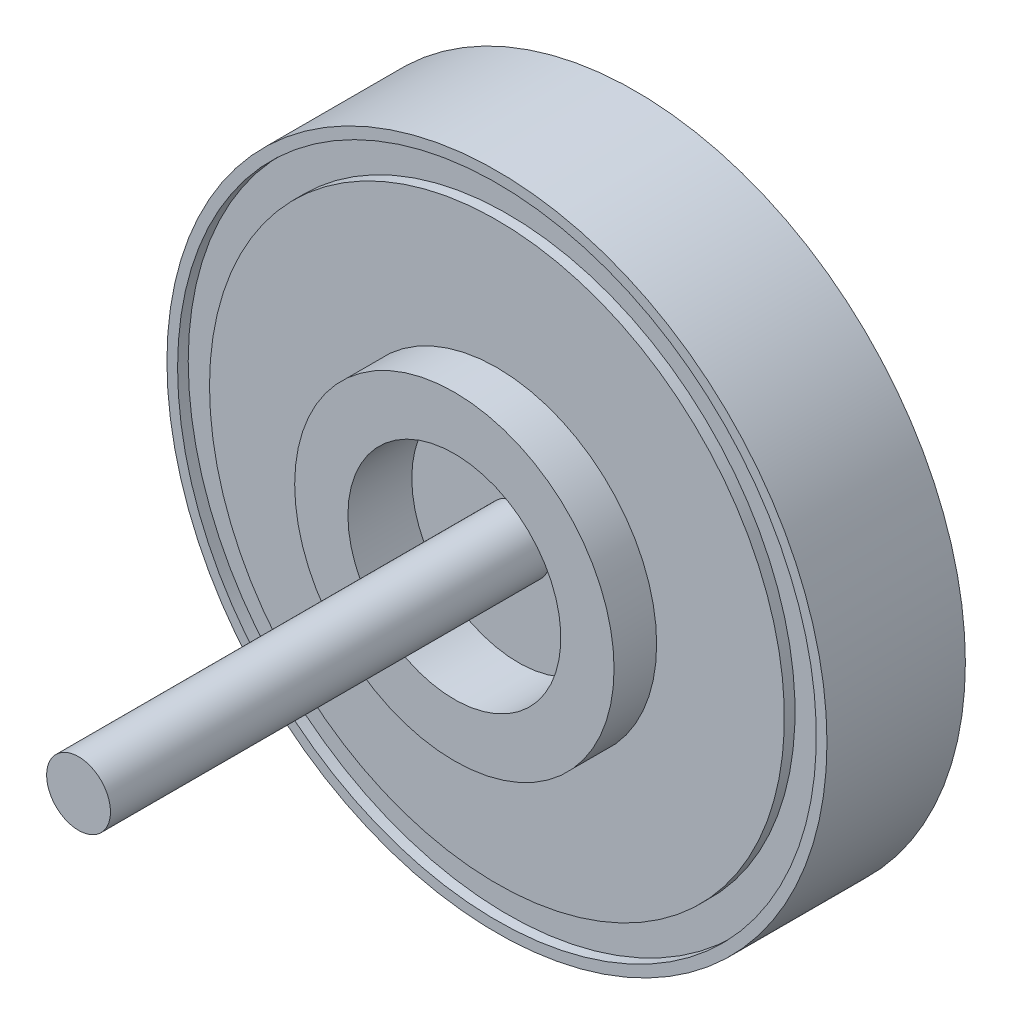
ISO-10303-21;
HEADER;
FILE_DESCRIPTION(('STEP AP214'),'2;1');
FILE_NAME('part.step','',(''),(''),'','','');
FILE_SCHEMA(('AUTOMOTIVE_DESIGN { 1 0 10303 214 1 1 1 1 }'));
ENDSEC;
DATA;
#1=APPLICATION_CONTEXT('core data for automotive mechanical design processes');
#2=APPLICATION_PROTOCOL_DEFINITION('international standard','automotive_design',2000,#1);
#3=PRODUCT_CONTEXT('',#1,'mechanical');
#4=PRODUCT('Part','Part','',(#3));
#5=PRODUCT_RELATED_PRODUCT_CATEGORY('part','',(#4));
#6=PRODUCT_DEFINITION_FORMATION('','',#4);
#7=PRODUCT_DEFINITION_CONTEXT('part definition',#1,'design');
#8=PRODUCT_DEFINITION('design','',#6,#7);
#9=PRODUCT_DEFINITION_SHAPE('','',#8);
#10=(LENGTH_UNIT() NAMED_UNIT(*) SI_UNIT(.MILLI.,.METRE.));
#11=(NAMED_UNIT(*) PLANE_ANGLE_UNIT() SI_UNIT($,.RADIAN.));
#12=(NAMED_UNIT(*) SI_UNIT($,.STERADIAN.) SOLID_ANGLE_UNIT());
#13=UNCERTAINTY_MEASURE_WITH_UNIT(LENGTH_MEASURE(1.E-05),#10,'distance_accuracy_value','');
#14=(GEOMETRIC_REPRESENTATION_CONTEXT(3) GLOBAL_UNCERTAINTY_ASSIGNED_CONTEXT((#13)) GLOBAL_UNIT_ASSIGNED_CONTEXT((#10,
#11,#12)) REPRESENTATION_CONTEXT('',''));
#15=CARTESIAN_POINT('',(0.,0.,0.));
#16=DIRECTION('',(0.,0.,1.));
#17=DIRECTION('',(1.,0.,0.));
#18=AXIS2_PLACEMENT_3D('',#15,#16,#17);
#19=CARTESIAN_POINT('',(0.,0.,41.3));
#20=DIRECTION('',(0.,0.,1.));
#21=DIRECTION('',(1.,0.,0.));
#22=AXIS2_PLACEMENT_3D('',#19,#20,#21);
#23=PLANE('',#22);
#24=CARTESIAN_POINT('',(0.,0.,41.3));
#25=DIRECTION('',(0.,0.,-1.));
#26=DIRECTION('',(-1.,0.,0.));
#27=AXIS2_PLACEMENT_3D('',#24,#25,#26);
#28=CIRCLE('',#27,3.);
#29=CARTESIAN_POINT('',(-3.,0.,41.3));
#30=VERTEX_POINT('',#29);
#31=EDGE_CURVE('E10',#30,#30,#28,.T.);
#32=ORIENTED_EDGE('',*,*,#31,.F.);
#33=EDGE_LOOP('',(#32));
#34=FACE_BOUND('',#33,.T.);
#35=ADVANCED_FACE('F30',(#34),#23,.T.);
#36=CARTESIAN_POINT('',(0.,0.,-13.7));
#37=DIRECTION('',(0.,0.,-1.));
#38=DIRECTION('',(-1.,0.,0.));
#39=AXIS2_PLACEMENT_3D('',#36,#37,#38);
#40=CYLINDRICAL_SURFACE('',#39,3.);
#41=ORIENTED_EDGE('',*,*,#31,.T.);
#42=EDGE_LOOP('',(#41));
#43=FACE_BOUND('',#42,.T.);
#44=CARTESIAN_POINT('',(0.,0.,0.));
#45=DIRECTION('',(0.,0.,-1.));
#46=DIRECTION('',(-1.,0.,0.));
#47=AXIS2_PLACEMENT_3D('',#44,#45,#46);
#48=CIRCLE('',#47,3.);
#49=CARTESIAN_POINT('',(-3.,0.,0.));
#50=VERTEX_POINT('',#49);
#51=EDGE_CURVE('E36',#50,#50,#48,.T.);
#52=ORIENTED_EDGE('',*,*,#51,.F.);
#53=EDGE_LOOP('',(#52));
#54=FACE_BOUND('',#53,.T.);
#55=ADVANCED_FACE('F120',(#43,#54),#40,.T.);
#56=CARTESIAN_POINT('',(0.,3.,0.));
#57=DIRECTION('',(0.,0.,1.));
#58=DIRECTION('',(1.,0.,0.));
#59=AXIS2_PLACEMENT_3D('',#56,#57,#58);
#60=PLANE('',#59);
#61=ORIENTED_EDGE('',*,*,#51,.T.);
#62=EDGE_LOOP('',(#61));
#63=FACE_BOUND('',#62,.T.);
#64=CARTESIAN_POINT('',(0.,0.,0.));
#65=DIRECTION('',(0.,0.,-1.));
#66=DIRECTION('',(-1.,0.,0.));
#67=AXIS2_PLACEMENT_3D('',#64,#65,#66);
#68=CIRCLE('',#67,10.);
#69=CARTESIAN_POINT('',(-10.,0.,0.));
#70=VERTEX_POINT('',#69);
#71=EDGE_CURVE('E40',#70,#70,#68,.T.);
#72=ORIENTED_EDGE('',*,*,#71,.F.);
#73=EDGE_LOOP('',(#72));
#74=FACE_BOUND('',#73,.T.);
#75=ADVANCED_FACE('F125',(#63,#74),#60,.T.);
#76=CARTESIAN_POINT('',(0.,0.,-13.7));
#77=DIRECTION('',(0.,0.,-1.));
#78=DIRECTION('',(-1.,0.,0.));
#79=AXIS2_PLACEMENT_3D('',#76,#77,#78);
#80=CYLINDRICAL_SURFACE('',#79,10.);
#81=ORIENTED_EDGE('',*,*,#71,.T.);
#82=EDGE_LOOP('',(#81));
#83=FACE_BOUND('',#82,.T.);
#84=CARTESIAN_POINT('',(0.,0.,6.));
#85=DIRECTION('',(0.,0.,-1.));
#86=DIRECTION('',(-1.,0.,0.));
#87=AXIS2_PLACEMENT_3D('',#84,#85,#86);
#88=CIRCLE('',#87,10.);
#89=CARTESIAN_POINT('',(-10.,0.,6.));
#90=VERTEX_POINT('',#89);
#91=EDGE_CURVE('E44',#90,#90,#88,.T.);
#92=ORIENTED_EDGE('',*,*,#91,.F.);
#93=EDGE_LOOP('',(#92));
#94=FACE_BOUND('',#93,.T.);
#95=ADVANCED_FACE('F129',(#83,#94),#80,.F.);
#96=CARTESIAN_POINT('',(0.,10.,6.));
#97=DIRECTION('',(0.,0.,1.));
#98=DIRECTION('',(1.,0.,0.));
#99=AXIS2_PLACEMENT_3D('',#96,#97,#98);
#100=PLANE('',#99);
#101=ORIENTED_EDGE('',*,*,#91,.T.);
#102=EDGE_LOOP('',(#101));
#103=FACE_BOUND('',#102,.T.);
#104=CARTESIAN_POINT('',(0.,0.,6.));
#105=DIRECTION('',(0.,0.,-1.));
#106=DIRECTION('',(-1.,0.,0.));
#107=AXIS2_PLACEMENT_3D('',#104,#105,#106);
#108=CIRCLE('',#107,15.);
#109=CARTESIAN_POINT('',(-15.,0.,6.));
#110=VERTEX_POINT('',#109);
#111=EDGE_CURVE('E49',#110,#110,#108,.T.);
#112=ORIENTED_EDGE('',*,*,#111,.F.);
#113=EDGE_LOOP('',(#112));
#114=FACE_BOUND('',#113,.T.);
#115=ADVANCED_FACE('F135',(#103,#114),#100,.T.);
#116=CARTESIAN_POINT('',(0.,0.,-13.7));
#117=DIRECTION('',(0.,0.,-1.));
#118=DIRECTION('',(-1.,0.,0.));
#119=AXIS2_PLACEMENT_3D('',#116,#117,#118);
#120=CYLINDRICAL_SURFACE('',#119,15.);
#121=ORIENTED_EDGE('',*,*,#111,.T.);
#122=EDGE_LOOP('',(#121));
#123=FACE_BOUND('',#122,.T.);
#124=CARTESIAN_POINT('',(0.,0.,2.));
#125=DIRECTION('',(0.,0.,-1.));
#126=DIRECTION('',(-1.,0.,0.));
#127=AXIS2_PLACEMENT_3D('',#124,#125,#126);
#128=CIRCLE('',#127,15.);
#129=CARTESIAN_POINT('',(-15.,0.,2.));
#130=VERTEX_POINT('',#129);
#131=EDGE_CURVE('E52',#130,#130,#128,.T.);
#132=ORIENTED_EDGE('',*,*,#131,.F.);
#133=EDGE_LOOP('',(#132));
#134=FACE_BOUND('',#133,.T.);
#135=ADVANCED_FACE('F139',(#123,#134),#120,.T.);
#136=CARTESIAN_POINT('',(0.,15.,2.));
#137=DIRECTION('',(0.,0.,1.));
#138=DIRECTION('',(1.,0.,0.));
#139=AXIS2_PLACEMENT_3D('',#136,#137,#138);
#140=PLANE('',#139);
#141=ORIENTED_EDGE('',*,*,#131,.T.);
#142=EDGE_LOOP('',(#141));
#143=FACE_BOUND('',#142,.T.);
#144=CARTESIAN_POINT('',(0.,0.,2.));
#145=DIRECTION('',(0.,0.,-1.));
#146=DIRECTION('',(-1.,0.,0.));
#147=AXIS2_PLACEMENT_3D('',#144,#145,#146);
#148=CIRCLE('',#147,27.);
#149=CARTESIAN_POINT('',(-27.,0.,2.));
#150=VERTEX_POINT('',#149);
#151=EDGE_CURVE('E55',#150,#150,#148,.T.);
#152=ORIENTED_EDGE('',*,*,#151,.F.);
#153=EDGE_LOOP('',(#152));
#154=FACE_BOUND('',#153,.T.);
#155=ADVANCED_FACE('F143',(#143,#154),#140,.T.);
#156=CARTESIAN_POINT('',(0.,0.,-13.7));
#157=DIRECTION('',(0.,0.,-1.));
#158=DIRECTION('',(-1.,0.,0.));
#159=AXIS2_PLACEMENT_3D('',#156,#157,#158);
#160=CYLINDRICAL_SURFACE('',#159,27.);
#161=ORIENTED_EDGE('',*,*,#151,.T.);
#162=EDGE_LOOP('',(#161));
#163=FACE_BOUND('',#162,.T.);
#164=CARTESIAN_POINT('',(0.,0.,1.));
#165=DIRECTION('',(0.,0.,-1.));
#166=DIRECTION('',(-1.,0.,0.));
#167=AXIS2_PLACEMENT_3D('',#164,#165,#166);
#168=CIRCLE('',#167,27.);
#169=CARTESIAN_POINT('',(-27.,0.,1.));
#170=VERTEX_POINT('',#169);
#171=EDGE_CURVE('E58',#170,#170,#168,.T.);
#172=ORIENTED_EDGE('',*,*,#171,.F.);
#173=EDGE_LOOP('',(#172));
#174=FACE_BOUND('',#173,.T.);
#175=ADVANCED_FACE('F147',(#163,#174),#160,.T.);
#176=CARTESIAN_POINT('',(0.,27.,1.));
#177=DIRECTION('',(0.,0.,1.));
#178=DIRECTION('',(1.,0.,0.));
#179=AXIS2_PLACEMENT_3D('',#176,#177,#178);
#180=PLANE('',#179);
#181=ORIENTED_EDGE('',*,*,#171,.T.);
#182=EDGE_LOOP('',(#181));
#183=FACE_BOUND('',#182,.T.);
#184=CARTESIAN_POINT('',(0.,0.,1.));
#185=DIRECTION('',(0.,0.,-1.));
#186=DIRECTION('',(-1.,0.,0.));
#187=AXIS2_PLACEMENT_3D('',#184,#185,#186);
#188=CIRCLE('',#187,30.);
#189=CARTESIAN_POINT('',(-30.,0.,1.));
#190=VERTEX_POINT('',#189);
#191=EDGE_CURVE('E61',#190,#190,#188,.T.);
#192=ORIENTED_EDGE('',*,*,#191,.F.);
#193=EDGE_LOOP('',(#192));
#194=FACE_BOUND('',#193,.T.);
#195=ADVANCED_FACE('F151',(#183,#194),#180,.T.);
#196=CARTESIAN_POINT('',(0.,0.,-13.7));
#197=DIRECTION('',(0.,0.,-1.));
#198=DIRECTION('',(-1.,0.,0.));
#199=AXIS2_PLACEMENT_3D('',#196,#197,#198);
#200=CYLINDRICAL_SURFACE('',#199,30.);
#201=ORIENTED_EDGE('',*,*,#191,.T.);
#202=EDGE_LOOP('',(#201));
#203=FACE_BOUND('',#202,.T.);
#204=CARTESIAN_POINT('',(0.,0.,1.99999999999999));
#205=DIRECTION('',(0.,0.,-1.));
#206=DIRECTION('',(-1.,0.,0.));
#207=AXIS2_PLACEMENT_3D('',#204,#205,#206);
#208=CIRCLE('',#207,30.);
#209=CARTESIAN_POINT('',(-30.,0.,1.99999999999999));
#210=VERTEX_POINT('',#209);
#211=EDGE_CURVE('E64',#210,#210,#208,.T.);
#212=ORIENTED_EDGE('',*,*,#211,.F.);
#213=EDGE_LOOP('',(#212));
#214=FACE_BOUND('',#213,.T.);
#215=ADVANCED_FACE('F155',(#203,#214),#200,.F.);
#216=CARTESIAN_POINT('',(0.,30.,1.99999999999999));
#217=DIRECTION('',(0.,0.,1.));
#218=DIRECTION('',(1.,0.,0.));
#219=AXIS2_PLACEMENT_3D('',#216,#217,#218);
#220=PLANE('',#219);
#221=ORIENTED_EDGE('',*,*,#211,.T.);
#222=EDGE_LOOP('',(#221));
#223=FACE_BOUND('',#222,.T.);
#224=CARTESIAN_POINT('',(0.,0.,1.99999999999999));
#225=DIRECTION('',(0.,0.,-1.));
#226=DIRECTION('',(-1.,0.,0.));
#227=AXIS2_PLACEMENT_3D('',#224,#225,#226);
#228=CIRCLE('',#227,31.);
#229=CARTESIAN_POINT('',(-31.,0.,1.99999999999999));
#230=VERTEX_POINT('',#229);
#231=EDGE_CURVE('E67',#230,#230,#228,.T.);
#232=ORIENTED_EDGE('',*,*,#231,.F.);
#233=EDGE_LOOP('',(#232));
#234=FACE_BOUND('',#233,.T.);
#235=ADVANCED_FACE('F159',(#223,#234),#220,.T.);
#236=CARTESIAN_POINT('',(0.,0.,-13.7));
#237=DIRECTION('',(0.,0.,-1.));
#238=DIRECTION('',(-1.,0.,0.));
#239=AXIS2_PLACEMENT_3D('',#236,#237,#238);
#240=CYLINDRICAL_SURFACE('',#239,31.);
#241=ORIENTED_EDGE('',*,*,#231,.T.);
#242=EDGE_LOOP('',(#241));
#243=FACE_BOUND('',#242,.T.);
#244=CARTESIAN_POINT('',(0.,0.,-11.));
#245=DIRECTION('',(0.,0.,-1.));
#246=DIRECTION('',(-1.,0.,0.));
#247=AXIS2_PLACEMENT_3D('',#244,#245,#246);
#248=CIRCLE('',#247,31.);
#249=CARTESIAN_POINT('',(-31.,0.,-11.));
#250=VERTEX_POINT('',#249);
#251=EDGE_CURVE('E70',#250,#250,#248,.T.);
#252=ORIENTED_EDGE('',*,*,#251,.F.);
#253=EDGE_LOOP('',(#252));
#254=FACE_BOUND('',#253,.T.);
#255=ADVANCED_FACE('F163',(#243,#254),#240,.T.);
#256=CARTESIAN_POINT('',(0.,31.,-11.));
#257=DIRECTION('',(0.,0.,-1.));
#258=DIRECTION('',(-1.,0.,0.));
#259=AXIS2_PLACEMENT_3D('',#256,#257,#258);
#260=PLANE('',#259);
#261=ORIENTED_EDGE('',*,*,#251,.T.);
#262=EDGE_LOOP('',(#261));
#263=FACE_BOUND('',#262,.T.);
#264=CARTESIAN_POINT('',(0.,0.,-11.));
#265=DIRECTION('',(0.,0.,-1.));
#266=DIRECTION('',(-1.,0.,0.));
#267=AXIS2_PLACEMENT_3D('',#264,#265,#266);
#268=CIRCLE('',#267,29.);
#269=CARTESIAN_POINT('',(-29.,0.,-11.));
#270=VERTEX_POINT('',#269);
#271=EDGE_CURVE('E73',#270,#270,#268,.T.);
#272=ORIENTED_EDGE('',*,*,#271,.F.);
#273=EDGE_LOOP('',(#272));
#274=FACE_BOUND('',#273,.T.);
#275=ADVANCED_FACE('F167',(#263,#274),#260,.T.);
#276=CARTESIAN_POINT('',(0.,0.,-13.7));
#277=DIRECTION('',(0.,0.,-1.));
#278=DIRECTION('',(-1.,0.,0.));
#279=AXIS2_PLACEMENT_3D('',#276,#277,#278);
#280=CYLINDRICAL_SURFACE('',#279,29.);
#281=ORIENTED_EDGE('',*,*,#271,.T.);
#282=EDGE_LOOP('',(#281));
#283=FACE_BOUND('',#282,.T.);
#284=CARTESIAN_POINT('',(0.,0.,-3.00000000000001));
#285=DIRECTION('',(0.,0.,-1.));
#286=DIRECTION('',(-1.,0.,0.));
#287=AXIS2_PLACEMENT_3D('',#284,#285,#286);
#288=CIRCLE('',#287,29.);
#289=CARTESIAN_POINT('',(-29.,0.,-3.00000000000001));
#290=VERTEX_POINT('',#289);
#291=EDGE_CURVE('E76',#290,#290,#288,.T.);
#292=ORIENTED_EDGE('',*,*,#291,.F.);
#293=EDGE_LOOP('',(#292));
#294=FACE_BOUND('',#293,.T.);
#295=ADVANCED_FACE('F171',(#283,#294),#280,.F.);
#296=CARTESIAN_POINT('',(0.,29.,-3.00000000000001));
#297=DIRECTION('',(0.,0.,-1.));
#298=DIRECTION('',(-1.,0.,0.));
#299=AXIS2_PLACEMENT_3D('',#296,#297,#298);
#300=PLANE('',#299);
#301=ORIENTED_EDGE('',*,*,#291,.T.);
#302=EDGE_LOOP('',(#301));
#303=FACE_BOUND('',#302,.T.);
#304=CARTESIAN_POINT('',(0.,0.,-3.00000000000001));
#305=DIRECTION('',(0.,0.,-1.));
#306=DIRECTION('',(-1.,0.,0.));
#307=AXIS2_PLACEMENT_3D('',#304,#305,#306);
#308=CIRCLE('',#307,22.);
#309=CARTESIAN_POINT('',(-22.,0.,-3.00000000000001));
#310=VERTEX_POINT('',#309);
#311=EDGE_CURVE('E79',#310,#310,#308,.T.);
#312=ORIENTED_EDGE('',*,*,#311,.F.);
#313=EDGE_LOOP('',(#312));
#314=FACE_BOUND('',#313,.T.);
#315=ADVANCED_FACE('F175',(#303,#314),#300,.T.);
#316=CARTESIAN_POINT('',(0.,0.,-13.7));
#317=DIRECTION('',(0.,0.,-1.));
#318=DIRECTION('',(-1.,0.,0.));
#319=AXIS2_PLACEMENT_3D('',#316,#317,#318);
#320=CYLINDRICAL_SURFACE('',#319,22.);
#321=ORIENTED_EDGE('',*,*,#311,.T.);
#322=EDGE_LOOP('',(#321));
#323=FACE_BOUND('',#322,.T.);
#324=CARTESIAN_POINT('',(0.,0.,-6.00000000000001));
#325=DIRECTION('',(0.,0.,-1.));
#326=DIRECTION('',(-1.,0.,0.));
#327=AXIS2_PLACEMENT_3D('',#324,#325,#326);
#328=CIRCLE('',#327,22.);
#329=CARTESIAN_POINT('',(-22.,0.,-6.00000000000001));
#330=VERTEX_POINT('',#329);
#331=EDGE_CURVE('E82',#330,#330,#328,.T.);
#332=ORIENTED_EDGE('',*,*,#331,.F.);
#333=EDGE_LOOP('',(#332));
#334=FACE_BOUND('',#333,.T.);
#335=ADVANCED_FACE('F179',(#323,#334),#320,.T.);
#336=CARTESIAN_POINT('',(0.,22.,-6.00000000000001));
#337=DIRECTION('',(0.,0.,-1.));
#338=DIRECTION('',(-1.,0.,0.));
#339=AXIS2_PLACEMENT_3D('',#336,#337,#338);
#340=PLANE('',#339);
#341=ORIENTED_EDGE('',*,*,#331,.T.);
#342=EDGE_LOOP('',(#341));
#343=FACE_BOUND('',#342,.T.);
#344=CARTESIAN_POINT('',(0.,0.,-6.00000000000001));
#345=DIRECTION('',(0.,0.,-1.));
#346=DIRECTION('',(-1.,0.,0.));
#347=AXIS2_PLACEMENT_3D('',#344,#345,#346);
#348=CIRCLE('',#347,14.);
#349=CARTESIAN_POINT('',(-14.,0.,-6.00000000000001));
#350=VERTEX_POINT('',#349);
#351=EDGE_CURVE('E85',#350,#350,#348,.T.);
#352=ORIENTED_EDGE('',*,*,#351,.F.);
#353=EDGE_LOOP('',(#352));
#354=FACE_BOUND('',#353,.T.);
#355=ADVANCED_FACE('F183',(#343,#354),#340,.T.);
#356=CARTESIAN_POINT('',(0.,0.,-13.7));
#357=DIRECTION('',(0.,0.,-1.));
#358=DIRECTION('',(-1.,0.,0.));
#359=AXIS2_PLACEMENT_3D('',#356,#357,#358);
#360=CYLINDRICAL_SURFACE('',#359,14.);
#361=ORIENTED_EDGE('',*,*,#351,.T.);
#362=EDGE_LOOP('',(#361));
#363=FACE_BOUND('',#362,.T.);
#364=CARTESIAN_POINT('',(0.,0.,-5.00000000000001));
#365=DIRECTION('',(0.,0.,-1.));
#366=DIRECTION('',(-1.,0.,0.));
#367=AXIS2_PLACEMENT_3D('',#364,#365,#366);
#368=CIRCLE('',#367,14.);
#369=CARTESIAN_POINT('',(-14.,0.,-5.00000000000001));
#370=VERTEX_POINT('',#369);
#371=EDGE_CURVE('E88',#370,#370,#368,.T.);
#372=ORIENTED_EDGE('',*,*,#371,.F.);
#373=EDGE_LOOP('',(#372));
#374=FACE_BOUND('',#373,.T.);
#375=ADVANCED_FACE('F187',(#363,#374),#360,.F.);
#376=CARTESIAN_POINT('',(0.,14.,-5.00000000000001));
#377=DIRECTION('',(0.,0.,-1.));
#378=DIRECTION('',(-1.,0.,0.));
#379=AXIS2_PLACEMENT_3D('',#376,#377,#378);
#380=PLANE('',#379);
#381=ORIENTED_EDGE('',*,*,#371,.T.);
#382=EDGE_LOOP('',(#381));
#383=FACE_BOUND('',#382,.T.);
#384=CARTESIAN_POINT('',(0.,0.,-5.00000000000001));
#385=DIRECTION('',(0.,0.,-1.));
#386=DIRECTION('',(-1.,0.,0.));
#387=AXIS2_PLACEMENT_3D('',#384,#385,#386);
#388=CIRCLE('',#387,8.99999999999996);
#389=CARTESIAN_POINT('',(-8.99999999999996,0.,-5.00000000000001));
#390=VERTEX_POINT('',#389);
#391=EDGE_CURVE('E91',#390,#390,#388,.T.);
#392=ORIENTED_EDGE('',*,*,#391,.F.);
#393=EDGE_LOOP('',(#392));
#394=FACE_BOUND('',#393,.T.);
#395=ADVANCED_FACE('F191',(#383,#394),#380,.T.);
#396=CARTESIAN_POINT('',(0.,0.,-13.7));
#397=DIRECTION('',(0.,0.,-1.));
#398=DIRECTION('',(-1.,0.,0.));
#399=AXIS2_PLACEMENT_3D('',#396,#397,#398);
#400=CYLINDRICAL_SURFACE('',#399,8.99999999999997);
#401=ORIENTED_EDGE('',*,*,#391,.T.);
#402=EDGE_LOOP('',(#401));
#403=FACE_BOUND('',#402,.T.);
#404=CARTESIAN_POINT('',(0.,0.,-10.));
#405=DIRECTION('',(0.,0.,-1.));
#406=DIRECTION('',(-1.,0.,0.));
#407=AXIS2_PLACEMENT_3D('',#404,#405,#406);
#408=CIRCLE('',#407,8.99999999999997);
#409=CARTESIAN_POINT('',(-8.99999999999997,0.,-10.));
#410=VERTEX_POINT('',#409);
#411=EDGE_CURVE('E94',#410,#410,#408,.T.);
#412=ORIENTED_EDGE('',*,*,#411,.F.);
#413=EDGE_LOOP('',(#412));
#414=FACE_BOUND('',#413,.T.);
#415=ADVANCED_FACE('F116',(#403,#414),#400,.T.);
#416=CARTESIAN_POINT('',(0.,8.99999999999996,-10.));
#417=DIRECTION('',(0.,0.,-1.));
#418=DIRECTION('',(-1.,0.,0.));
#419=AXIS2_PLACEMENT_3D('',#416,#417,#418);
#420=PLANE('',#419);
#421=ORIENTED_EDGE('',*,*,#411,.T.);
#422=EDGE_LOOP('',(#421));
#423=FACE_BOUND('',#422,.T.);
#424=CARTESIAN_POINT('',(0.,0.,-10.));
#425=DIRECTION('',(0.,0.,-1.));
#426=DIRECTION('',(-1.,0.,0.));
#427=AXIS2_PLACEMENT_3D('',#424,#425,#426);
#428=CIRCLE('',#427,2.99999999999996);
#429=CARTESIAN_POINT('',(-2.99999999999996,0.,-10.));
#430=VERTEX_POINT('',#429);
#431=EDGE_CURVE('E97',#430,#430,#428,.T.);
#432=ORIENTED_EDGE('',*,*,#431,.F.);
#433=EDGE_LOOP('',(#432));
#434=FACE_BOUND('',#433,.T.);
#435=ADVANCED_FACE('F108',(#423,#434),#420,.T.);
#436=CARTESIAN_POINT('',(0.,0.,-13.7));
#437=DIRECTION('',(0.,0.,-1.));
#438=DIRECTION('',(-1.,0.,0.));
#439=AXIS2_PLACEMENT_3D('',#436,#437,#438);
#440=CYLINDRICAL_SURFACE('',#439,2.99999999999997);
#441=ORIENTED_EDGE('',*,*,#431,.T.);
#442=EDGE_LOOP('',(#441));
#443=FACE_BOUND('',#442,.T.);
#444=CARTESIAN_POINT('',(0.,0.,-13.7));
#445=DIRECTION('',(0.,0.,-1.));
#446=DIRECTION('',(-1.,0.,0.));
#447=AXIS2_PLACEMENT_3D('',#444,#445,#446);
#448=CIRCLE('',#447,2.99999999999997);
#449=CARTESIAN_POINT('',(-2.99999999999997,0.,-13.7));
#450=VERTEX_POINT('',#449);
#451=EDGE_CURVE('E100',#450,#450,#448,.T.);
#452=ORIENTED_EDGE('',*,*,#451,.F.);
#453=EDGE_LOOP('',(#452));
#454=FACE_BOUND('',#453,.T.);
#455=ADVANCED_FACE('F106',(#443,#454),#440,.T.);
#456=CARTESIAN_POINT('',(0.,2.99999999999997,-13.7));
#457=DIRECTION('',(0.,0.,-1.));
#458=DIRECTION('',(-1.,0.,0.));
#459=AXIS2_PLACEMENT_3D('',#456,#457,#458);
#460=PLANE('',#459);
#461=ORIENTED_EDGE('',*,*,#451,.T.);
#462=EDGE_LOOP('',(#461));
#463=FACE_BOUND('',#462,.T.);
#464=ADVANCED_FACE('F104',(#463),#460,.T.);
#465=CLOSED_SHELL('',(#35,#55,#75,#95,#115,#135,#155,#175,#195,#215,#235,#255,#275,#295,#315,
#335,#355,#375,#395,#415,#435,#455,#464));
#466=MANIFOLD_SOLID_BREP('B2',#465);
#467=ADVANCED_BREP_SHAPE_REPRESENTATION('',(#18,#466),#14);
#468=SHAPE_DEFINITION_REPRESENTATION(#9,#467);
ENDSEC;
END-ISO-10303-21;
